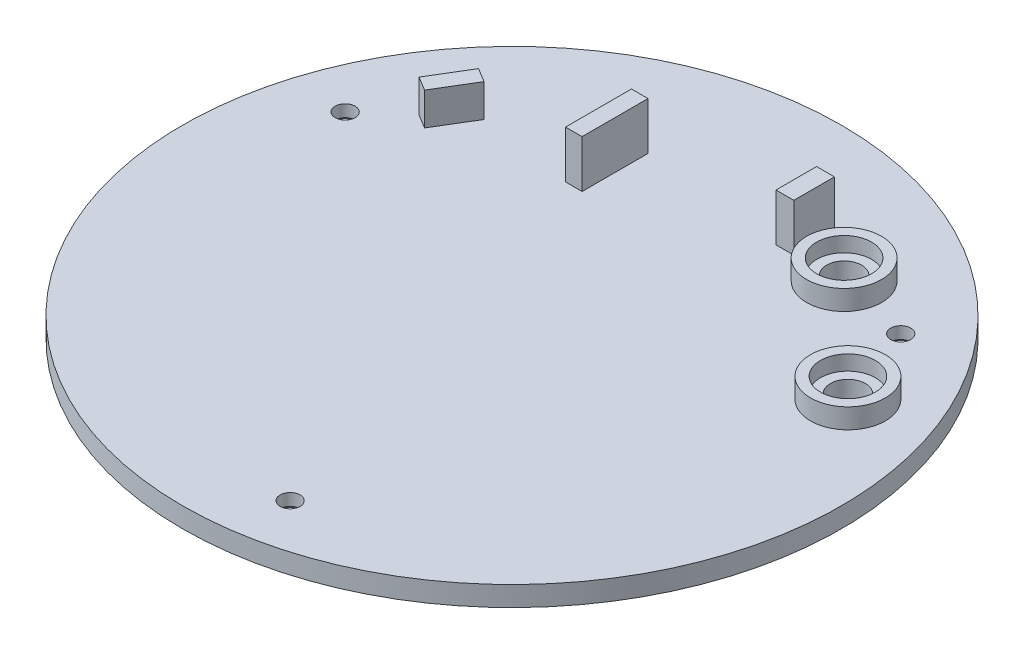
ISO-10303-21;
HEADER;
FILE_DESCRIPTION(('STEP AP214'),'2;1');
FILE_NAME('part.step','',(''),(''),'','','');
FILE_SCHEMA(('AUTOMOTIVE_DESIGN { 1 0 10303 214 1 1 1 1 }'));
ENDSEC;
DATA;
#1=APPLICATION_CONTEXT('core data for automotive mechanical design processes');
#2=APPLICATION_PROTOCOL_DEFINITION('international standard','automotive_design',2000,#1);
#3=PRODUCT_CONTEXT('',#1,'mechanical');
#4=PRODUCT('Part','Part','',(#3));
#5=PRODUCT_RELATED_PRODUCT_CATEGORY('part','',(#4));
#6=PRODUCT_DEFINITION_FORMATION('','',#4);
#7=PRODUCT_DEFINITION_CONTEXT('part definition',#1,'design');
#8=PRODUCT_DEFINITION('design','',#6,#7);
#9=PRODUCT_DEFINITION_SHAPE('','',#8);
#10=(LENGTH_UNIT() NAMED_UNIT(*) SI_UNIT(.MILLI.,.METRE.));
#11=(NAMED_UNIT(*) PLANE_ANGLE_UNIT() SI_UNIT($,.RADIAN.));
#12=(NAMED_UNIT(*) SI_UNIT($,.STERADIAN.) SOLID_ANGLE_UNIT());
#13=UNCERTAINTY_MEASURE_WITH_UNIT(LENGTH_MEASURE(1.E-05),#10,'distance_accuracy_value','');
#14=(GEOMETRIC_REPRESENTATION_CONTEXT(3) GLOBAL_UNCERTAINTY_ASSIGNED_CONTEXT((#13)) GLOBAL_UNIT_ASSIGNED_CONTEXT((#10,
#11,#12)) REPRESENTATION_CONTEXT('',''));
#15=CARTESIAN_POINT('',(0.,0.,0.));
#16=DIRECTION('',(0.,0.,1.));
#17=DIRECTION('',(1.,0.,0.));
#18=AXIS2_PLACEMENT_3D('',#15,#16,#17);
#19=CARTESIAN_POINT('',(21.052790792877,-12.25,-17.8713903028272));
#20=DIRECTION('',(0.,-1.,0.));
#21=DIRECTION('',(0.,0.,-1.));
#22=AXIS2_PLACEMENT_3D('',#19,#20,#21);
#23=CYLINDRICAL_SURFACE('',#22,1.);
#24=CARTESIAN_POINT('',(21.052790792877,-12.25,-17.8713903028272));
#25=DIRECTION('',(0.,-1.,0.));
#26=DIRECTION('',(0.,0.,-1.));
#27=AXIS2_PLACEMENT_3D('',#24,#25,#26);
#28=CIRCLE('',#27,1.);
#29=CARTESIAN_POINT('',(21.052790792877,-12.25,-18.8713903028272));
#30=VERTEX_POINT('',#29);
#31=EDGE_CURVE('E468',#30,#30,#28,.T.);
#32=ORIENTED_EDGE('',*,*,#31,.F.);
#33=EDGE_LOOP('',(#32));
#34=FACE_BOUND('',#33,.T.);
#35=CARTESIAN_POINT('',(21.052790792877,-13.45,-17.8713903028272));
#36=DIRECTION('',(0.,-1.,0.));
#37=DIRECTION('',(1.,0.,0.));
#38=AXIS2_PLACEMENT_3D('',#35,#36,#37);
#39=CIRCLE('',#38,1.);
#40=CARTESIAN_POINT('',(22.052790792877,-13.45,-17.8713903028272));
#41=VERTEX_POINT('',#40);
#42=EDGE_CURVE('E487',#41,#41,#39,.T.);
#43=ORIENTED_EDGE('',*,*,#42,.T.);
#44=EDGE_LOOP('',(#43));
#45=FACE_BOUND('',#44,.T.);
#46=ADVANCED_FACE('F75',(#34,#45),#23,.F.);
#47=CARTESIAN_POINT('',(4.95068260675662,-12.25,27.1679467986042));
#48=DIRECTION('',(0.,-1.,0.));
#49=DIRECTION('',(0.,0.,-1.));
#50=AXIS2_PLACEMENT_3D('',#47,#48,#49);
#51=CYLINDRICAL_SURFACE('',#50,1.);
#52=CARTESIAN_POINT('',(4.95068260675662,-12.25,27.1679467986042));
#53=DIRECTION('',(0.,-1.,0.));
#54=DIRECTION('',(0.,0.,-1.));
#55=AXIS2_PLACEMENT_3D('',#52,#53,#54);
#56=CIRCLE('',#55,1.);
#57=CARTESIAN_POINT('',(4.95068260675662,-12.25,26.1679467986042));
#58=VERTEX_POINT('',#57);
#59=EDGE_CURVE('E472',#58,#58,#56,.T.);
#60=ORIENTED_EDGE('',*,*,#59,.F.);
#61=EDGE_LOOP('',(#60));
#62=FACE_BOUND('',#61,.T.);
#63=CARTESIAN_POINT('',(4.95068260675662,-13.45,27.1679467986042));
#64=DIRECTION('',(0.,-1.,0.));
#65=DIRECTION('',(1.,0.,0.));
#66=AXIS2_PLACEMENT_3D('',#63,#64,#65);
#67=CIRCLE('',#66,1.);
#68=CARTESIAN_POINT('',(5.95068260675662,-13.45,27.1679467986042));
#69=VERTEX_POINT('',#68);
#70=EDGE_CURVE('E489',#69,#69,#67,.T.);
#71=ORIENTED_EDGE('',*,*,#70,.T.);
#72=EDGE_LOOP('',(#71));
#73=FACE_BOUND('',#72,.T.);
#74=ADVANCED_FACE('F307',(#62,#73),#51,.F.);
#75=CARTESIAN_POINT('',(-26.0034733996337,-12.25,-9.29655649577725));
#76=DIRECTION('',(0.,-1.,0.));
#77=DIRECTION('',(0.,0.,-1.));
#78=AXIS2_PLACEMENT_3D('',#75,#76,#77);
#79=CYLINDRICAL_SURFACE('',#78,1.);
#80=CARTESIAN_POINT('',(-26.0034733996337,-12.25,-9.29655649577725));
#81=DIRECTION('',(0.,-1.,0.));
#82=DIRECTION('',(0.,0.,-1.));
#83=AXIS2_PLACEMENT_3D('',#80,#81,#82);
#84=CIRCLE('',#83,1.);
#85=CARTESIAN_POINT('',(-26.0034733996337,-12.25,-10.2965564957772));
#86=VERTEX_POINT('',#85);
#87=EDGE_CURVE('E469',#86,#86,#84,.T.);
#88=ORIENTED_EDGE('',*,*,#87,.F.);
#89=EDGE_LOOP('',(#88));
#90=FACE_BOUND('',#89,.T.);
#91=CARTESIAN_POINT('',(-26.0034733996338,-13.45,-9.29655649577689));
#92=DIRECTION('',(0.,-1.,0.));
#93=DIRECTION('',(1.,0.,0.));
#94=AXIS2_PLACEMENT_3D('',#91,#92,#93);
#95=CIRCLE('',#94,1.00000000000001);
#96=CARTESIAN_POINT('',(-25.0034733996338,-13.45,-9.29655649577689));
#97=VERTEX_POINT('',#96);
#98=EDGE_CURVE('E480',#97,#97,#95,.T.);
#99=ORIENTED_EDGE('',*,*,#98,.T.);
#100=EDGE_LOOP('',(#99));
#101=FACE_BOUND('',#100,.T.);
#102=ADVANCED_FACE('F314',(#90,#101),#79,.F.);
#103=CARTESIAN_POINT('',(24.0914108515431,-10.25,-9.54622091284926));
#104=DIRECTION('',(0.,-1.,0.));
#105=DIRECTION('',(0.,0.,-1.));
#106=AXIS2_PLACEMENT_3D('',#103,#104,#105);
#107=CYLINDRICAL_SURFACE('',#106,1.75);
#108=CARTESIAN_POINT('',(24.0914108515431,-14.25,-9.54622091284926));
#109=DIRECTION('',(0.,-1.,0.));
#110=DIRECTION('',(0.,0.,-1.));
#111=AXIS2_PLACEMENT_3D('',#108,#109,#110);
#112=CIRCLE('',#111,1.75);
#113=CARTESIAN_POINT('',(24.0914108515431,-14.25,-11.2962209128493));
#114=VERTEX_POINT('',#113);
#115=EDGE_CURVE('E422',#114,#114,#112,.T.);
#116=ORIENTED_EDGE('',*,*,#115,.T.);
#117=EDGE_LOOP('',(#116));
#118=FACE_BOUND('',#117,.T.);
#119=CARTESIAN_POINT('',(24.0914108515431,-11.75,-9.54622091284926));
#120=DIRECTION('',(0.,1.,0.));
#121=DIRECTION('',(0.,0.,1.));
#122=AXIS2_PLACEMENT_3D('',#119,#120,#121);
#123=CIRCLE('',#122,1.75);
#124=CARTESIAN_POINT('',(24.0914108515431,-11.75,-7.79622091284926));
#125=VERTEX_POINT('',#124);
#126=EDGE_CURVE('E463',#125,#125,#123,.T.);
#127=ORIENTED_EDGE('',*,*,#126,.T.);
#128=EDGE_LOOP('',(#127));
#129=FACE_BOUND('',#128,.T.);
#130=ADVANCED_FACE('F344',(#118,#129),#107,.F.);
#131=CARTESIAN_POINT('',(13.6355146671841,-10.25,-19.6205793603908));
#132=DIRECTION('',(0.,-1.,0.));
#133=DIRECTION('',(0.,0.,-1.));
#134=AXIS2_PLACEMENT_3D('',#131,#132,#133);
#135=CYLINDRICAL_SURFACE('',#134,1.75);
#136=CARTESIAN_POINT('',(13.6355146671841,-14.25,-19.6205793603908));
#137=DIRECTION('',(0.,-1.,0.));
#138=DIRECTION('',(0.,0.,-1.));
#139=AXIS2_PLACEMENT_3D('',#136,#137,#138);
#140=CIRCLE('',#139,1.75);
#141=CARTESIAN_POINT('',(13.6355146671841,-14.25,-21.3705793603908));
#142=VERTEX_POINT('',#141);
#143=EDGE_CURVE('E428',#142,#142,#140,.T.);
#144=ORIENTED_EDGE('',*,*,#143,.T.);
#145=EDGE_LOOP('',(#144));
#146=FACE_BOUND('',#145,.T.);
#147=CARTESIAN_POINT('',(13.6355146671841,-11.75,-19.6205793603908));
#148=DIRECTION('',(0.,1.,0.));
#149=DIRECTION('',(0.,0.,1.));
#150=AXIS2_PLACEMENT_3D('',#147,#148,#149);
#151=CIRCLE('',#150,1.75);
#152=CARTESIAN_POINT('',(13.6355146671841,-11.75,-17.8705793603908));
#153=VERTEX_POINT('',#152);
#154=EDGE_CURVE('E458',#153,#153,#151,.T.);
#155=ORIENTED_EDGE('',*,*,#154,.T.);
#156=EDGE_LOOP('',(#155));
#157=FACE_BOUND('',#156,.T.);
#158=ADVANCED_FACE('F278',(#146,#157),#135,.F.);
#159=CARTESIAN_POINT('',(0.,-12.25,0.));
#160=DIRECTION('',(0.,-1.,0.));
#161=DIRECTION('',(0.,0.,-1.));
#162=AXIS2_PLACEMENT_3D('',#159,#160,#161);
#163=PLANE('',#162);
#164=ORIENTED_EDGE('',*,*,#87,.T.);
#165=EDGE_LOOP('',(#164));
#166=FACE_BOUND('',#165,.T.);
#167=ORIENTED_EDGE('',*,*,#59,.T.);
#168=EDGE_LOOP('',(#167));
#169=FACE_BOUND('',#168,.T.);
#170=ORIENTED_EDGE('',*,*,#31,.T.);
#171=EDGE_LOOP('',(#170));
#172=FACE_BOUND('',#171,.T.);
#173=CARTESIAN_POINT('',(13.6355146671841,-12.25,-19.6205793603908));
#174=DIRECTION('',(0.,-1.,0.));
#175=DIRECTION('',(0.,0.,-1.));
#176=AXIS2_PLACEMENT_3D('',#173,#174,#175);
#177=CIRCLE('',#176,3.75);
#178=CARTESIAN_POINT('',(13.6355146671841,-12.25,-23.3705793603908));
#179=VERTEX_POINT('',#178);
#180=EDGE_CURVE('E12',#179,#179,#177,.F.);
#181=ORIENTED_EDGE('',*,*,#180,.F.);
#182=EDGE_LOOP('',(#181));
#183=FACE_BOUND('',#182,.T.);
#184=CARTESIAN_POINT('',(24.0914108515431,-12.25,-9.54622091284926));
#185=DIRECTION('',(0.,-1.,0.));
#186=DIRECTION('',(0.,0.,-1.));
#187=AXIS2_PLACEMENT_3D('',#184,#185,#186);
#188=CIRCLE('',#187,3.75);
#189=CARTESIAN_POINT('',(24.0914108515431,-12.25,-13.2962209128493));
#190=VERTEX_POINT('',#189);
#191=EDGE_CURVE('E83',#190,#190,#188,.F.);
#192=ORIENTED_EDGE('',*,*,#191,.F.);
#193=EDGE_LOOP('',(#192));
#194=FACE_BOUND('',#193,.T.);
#195=DIRECTION('',(-1.,0.,0.));
#196=VECTOR('',#195,1.);
#197=CARTESIAN_POINT('',(8.88267400832492,-12.25,-23.403156600962));
#198=LINE('',#197,#196);
#199=CARTESIAN_POINT('',(8.88267400832492,-12.25,-23.403156600962));
#200=VERTEX_POINT('',#199);
#201=CARTESIAN_POINT('',(7.09558008984392,-12.25,-23.403156600962));
#202=VERTEX_POINT('',#201);
#203=EDGE_CURVE('E203',#200,#202,#198,.T.);
#204=ORIENTED_EDGE('',*,*,#203,.F.);
#205=DIRECTION('',(0.,0.,-1.));
#206=VECTOR('',#205,1.);
#207=CARTESIAN_POINT('',(8.88267400832492,-12.25,-23.403156600962));
#208=LINE('',#207,#206);
#209=CARTESIAN_POINT('',(8.88267400832492,-12.25,-19.339156600962));
#210=VERTEX_POINT('',#209);
#211=EDGE_CURVE('E215',#210,#200,#208,.T.);
#212=ORIENTED_EDGE('',*,*,#211,.F.);
#213=DIRECTION('',(1.,0.,0.));
#214=VECTOR('',#213,1.);
#215=CARTESIAN_POINT('',(8.88267400832492,-12.25,-19.339156600962));
#216=LINE('',#215,#214);
#217=CARTESIAN_POINT('',(7.09558008984392,-12.25,-19.339156600962));
#218=VERTEX_POINT('',#217);
#219=EDGE_CURVE('E213',#218,#210,#216,.T.);
#220=ORIENTED_EDGE('',*,*,#219,.F.);
#221=DIRECTION('',(0.,0.,1.));
#222=VECTOR('',#221,1.);
#223=CARTESIAN_POINT('',(7.09558008984392,-12.25,-23.403156600962));
#224=LINE('',#223,#222);
#225=EDGE_CURVE('E210',#202,#218,#224,.T.);
#226=ORIENTED_EDGE('',*,*,#225,.F.);
#227=EDGE_LOOP('',(#204,#212,#220,#226));
#228=FACE_BOUND('',#227,.T.);
#229=CARTESIAN_POINT('',(0.,-12.25,0.));
#230=DIRECTION('',(0.,-1.,0.));
#231=DIRECTION('',(0.,0.,-1.));
#232=AXIS2_PLACEMENT_3D('',#229,#230,#231);
#233=CIRCLE('',#232,33.);
#234=CARTESIAN_POINT('',(0.,-12.25,-33.));
#235=VERTEX_POINT('',#234);
#236=EDGE_CURVE('E205',#235,#235,#233,.T.);
#237=ORIENTED_EDGE('',*,*,#236,.F.);
#238=EDGE_LOOP('',(#237));
#239=FACE_BOUND('',#238,.T.);
#240=DIRECTION('',(1.,0.,0.));
#241=VECTOR('',#240,1.);
#242=CARTESIAN_POINT('',(-8.89732599167508,-12.25,-14.259156600962));
#243=LINE('',#242,#241);
#244=CARTESIAN_POINT('',(-8.89732599167508,-12.25,-14.259156600962));
#245=VERTEX_POINT('',#244);
#246=CARTESIAN_POINT('',(-7.24129071075527,-12.25,-14.259156600962));
#247=VERTEX_POINT('',#246);
#248=EDGE_CURVE('E206',#245,#247,#243,.T.);
#249=ORIENTED_EDGE('',*,*,#248,.F.);
#250=DIRECTION('',(0.,0.,1.));
#251=VECTOR('',#250,1.);
#252=CARTESIAN_POINT('',(-8.89732599167508,-12.25,-14.259156600962));
#253=LINE('',#252,#251);
#254=CARTESIAN_POINT('',(-8.89732599167508,-12.25,-20.863156600962));
#255=VERTEX_POINT('',#254);
#256=EDGE_CURVE('E250',#255,#245,#253,.T.);
#257=ORIENTED_EDGE('',*,*,#256,.F.);
#258=DIRECTION('',(-1.,0.,0.));
#259=VECTOR('',#258,1.);
#260=CARTESIAN_POINT('',(-8.89732599167508,-12.25,-20.863156600962));
#261=LINE('',#260,#259);
#262=CARTESIAN_POINT('',(-7.24129071075527,-12.25,-20.863156600962));
#263=VERTEX_POINT('',#262);
#264=EDGE_CURVE('E249',#263,#255,#261,.T.);
#265=ORIENTED_EDGE('',*,*,#264,.F.);
#266=DIRECTION('',(0.,0.,-1.));
#267=VECTOR('',#266,1.);
#268=CARTESIAN_POINT('',(-7.24129071075527,-12.25,-14.259156600962));
#269=LINE('',#268,#267);
#270=EDGE_CURVE('E254',#247,#263,#269,.T.);
#271=ORIENTED_EDGE('',*,*,#270,.F.);
#272=EDGE_LOOP('',(#249,#257,#265,#271));
#273=FACE_BOUND('',#272,.T.);
#274=DIRECTION('',(0.855858760805712,0.,0.517209610846619));
#275=VECTOR('',#274,1.);
#276=CARTESIAN_POINT('',(-22.0469894878762,-12.25,-12.733470206983));
#277=LINE('',#276,#275);
#278=CARTESIAN_POINT('',(-22.0469894878762,-12.25,-12.733470206983));
#279=VERTEX_POINT('',#278);
#280=CARTESIAN_POINT('',(-20.6377240159575,-12.25,-11.8818277635213));
#281=VERTEX_POINT('',#280);
#282=EDGE_CURVE('E158',#279,#281,#277,.T.);
#283=ORIENTED_EDGE('',*,*,#282,.F.);
#284=DIRECTION('',(-0.517209610846618,0.,0.855858760805713));
#285=VECTOR('',#284,1.);
#286=CARTESIAN_POINT('',(-22.0469894878762,-12.25,-12.733470206983));
#287=LINE('',#286,#285);
#288=CARTESIAN_POINT('',(-19.8006122147574,-12.25,-16.4506897422628));
#289=VERTEX_POINT('',#288);
#290=EDGE_CURVE('E161',#289,#279,#287,.T.);
#291=ORIENTED_EDGE('',*,*,#290,.F.);
#292=DIRECTION('',(-0.855858760805712,0.,-0.517209610846619));
#293=VECTOR('',#292,1.);
#294=CARTESIAN_POINT('',(-19.8006122147574,-12.25,-16.4506897422628));
#295=LINE('',#294,#293);
#296=CARTESIAN_POINT('',(-18.3913467428388,-12.25,-15.5990472988012));
#297=VERTEX_POINT('',#296);
#298=EDGE_CURVE('E95',#297,#289,#295,.T.);
#299=ORIENTED_EDGE('',*,*,#298,.F.);
#300=DIRECTION('',(0.517209610846618,0.,-0.855858760805713));
#301=VECTOR('',#300,1.);
#302=CARTESIAN_POINT('',(-20.6377240159575,-12.25,-11.8818277635213));
#303=LINE('',#302,#301);
#304=EDGE_CURVE('E87',#281,#297,#303,.T.);
#305=ORIENTED_EDGE('',*,*,#304,.F.);
#306=EDGE_LOOP('',(#283,#291,#299,#305));
#307=FACE_BOUND('',#306,.T.);
#308=ADVANCED_FACE('F163',(#166,#169,#172,#183,#194,#228,#239,#273,#307),#163,.F.);
#309=CARTESIAN_POINT('',(0.,-14.25,0.));
#310=DIRECTION('',(0.,1.,0.));
#311=DIRECTION('',(0.,0.,1.));
#312=AXIS2_PLACEMENT_3D('',#309,#310,#311);
#313=CYLINDRICAL_SURFACE('',#312,33.);
#314=CARTESIAN_POINT('',(0.,-14.25,0.));
#315=DIRECTION('',(0.,-1.,0.));
#316=DIRECTION('',(0.,0.,-1.));
#317=AXIS2_PLACEMENT_3D('',#314,#315,#316);
#318=CIRCLE('',#317,33.);
#319=CARTESIAN_POINT('',(0.,-14.25,-33.));
#320=VERTEX_POINT('',#319);
#321=EDGE_CURVE('E261',#320,#320,#318,.T.);
#322=ORIENTED_EDGE('',*,*,#321,.F.);
#323=EDGE_LOOP('',(#322));
#324=FACE_BOUND('',#323,.T.);
#325=ORIENTED_EDGE('',*,*,#236,.T.);
#326=EDGE_LOOP('',(#325));
#327=FACE_BOUND('',#326,.T.);
#328=ADVANCED_FACE('F72',(#324,#327),#313,.T.);
#329=CARTESIAN_POINT('',(0.,-14.25,0.));
#330=DIRECTION('',(0.,-1.,0.));
#331=DIRECTION('',(0.,0.,-1.));
#332=AXIS2_PLACEMENT_3D('',#329,#330,#331);
#333=PLANE('',#332);
#334=CARTESIAN_POINT('',(4.95068260675662,-14.25,27.1679467986042));
#335=DIRECTION('',(0.,-1.,0.));
#336=DIRECTION('',(0.,0.,-1.));
#337=AXIS2_PLACEMENT_3D('',#334,#335,#336);
#338=CIRCLE('',#337,2.);
#339=CARTESIAN_POINT('',(4.95068260675662,-14.25,25.1679467986042));
#340=VERTEX_POINT('',#339);
#341=EDGE_CURVE('E406',#340,#340,#338,.T.);
#342=ORIENTED_EDGE('',*,*,#341,.F.);
#343=EDGE_LOOP('',(#342));
#344=FACE_BOUND('',#343,.T.);
#345=CARTESIAN_POINT('',(21.052790792877,-14.25,-17.8713903028272));
#346=DIRECTION('',(0.,-1.,0.));
#347=DIRECTION('',(0.,0.,-1.));
#348=AXIS2_PLACEMENT_3D('',#345,#346,#347);
#349=CIRCLE('',#348,2.);
#350=CARTESIAN_POINT('',(21.052790792877,-14.25,-19.8713903028272));
#351=VERTEX_POINT('',#350);
#352=EDGE_CURVE('E415',#351,#351,#349,.T.);
#353=ORIENTED_EDGE('',*,*,#352,.F.);
#354=EDGE_LOOP('',(#353));
#355=FACE_BOUND('',#354,.T.);
#356=CARTESIAN_POINT('',(-26.0034733996338,-14.25,-9.29655649577689));
#357=DIRECTION('',(0.,-1.,0.));
#358=DIRECTION('',(0.,0.,-1.));
#359=AXIS2_PLACEMENT_3D('',#356,#357,#358);
#360=CIRCLE('',#359,2.00000000000001);
#361=CARTESIAN_POINT('',(-26.0034733996338,-14.25,-11.2965564957769));
#362=VERTEX_POINT('',#361);
#363=EDGE_CURVE('E420',#362,#362,#360,.T.);
#364=ORIENTED_EDGE('',*,*,#363,.F.);
#365=EDGE_LOOP('',(#364));
#366=FACE_BOUND('',#365,.T.);
#367=ORIENTED_EDGE('',*,*,#115,.F.);
#368=EDGE_LOOP('',(#367));
#369=FACE_BOUND('',#368,.T.);
#370=ORIENTED_EDGE('',*,*,#143,.F.);
#371=EDGE_LOOP('',(#370));
#372=FACE_BOUND('',#371,.T.);
#373=ORIENTED_EDGE('',*,*,#321,.T.);
#374=EDGE_LOOP('',(#373));
#375=FACE_BOUND('',#374,.T.);
#376=ADVANCED_FACE('F399',(#344,#355,#366,#369,#372,#375),#333,.T.);
#377=CARTESIAN_POINT('',(-8.89732599167508,-0.681529624720492,-14.259156600962));
#378=DIRECTION('',(1.,0.,0.));
#379=DIRECTION('',(0.,0.,-1.));
#380=AXIS2_PLACEMENT_3D('',#377,#378,#379);
#381=PLANE('',#380);
#382=DIRECTION('',(0.,-1.,0.));
#383=VECTOR('',#382,1.);
#384=CARTESIAN_POINT('',(-8.89732599167508,-0.681529624720492,-14.259156600962));
#385=LINE('',#384,#383);
#386=CARTESIAN_POINT('',(-8.89732599167508,-7.49000000004321,-14.259156600962));
#387=VERTEX_POINT('',#386);
#388=EDGE_CURVE('E242',#387,#245,#385,.T.);
#389=ORIENTED_EDGE('',*,*,#388,.F.);
#390=DIRECTION('',(0.,0.,-1.));
#391=VECTOR('',#390,1.);
#392=CARTESIAN_POINT('',(-8.89732599167508,-7.49000000004321,-14.2591566009614));
#393=LINE('',#392,#391);
#394=CARTESIAN_POINT('',(-8.89732599167508,-7.49000000004351,-20.863156600962));
#395=VERTEX_POINT('',#394);
#396=EDGE_CURVE('E233',#387,#395,#393,.T.);
#397=ORIENTED_EDGE('',*,*,#396,.T.);
#398=DIRECTION('',(0.,-1.,0.));
#399=VECTOR('',#398,1.);
#400=CARTESIAN_POINT('',(-8.89732599167508,-0.681529624720492,-20.863156600962));
#401=LINE('',#400,#399);
#402=EDGE_CURVE('E241',#395,#255,#401,.T.);
#403=ORIENTED_EDGE('',*,*,#402,.T.);
#404=ORIENTED_EDGE('',*,*,#256,.T.);
#405=EDGE_LOOP('',(#389,#397,#403,#404));
#406=FACE_BOUND('',#405,.T.);
#407=ADVANCED_FACE('F289',(#406),#381,.F.);
#408=CARTESIAN_POINT('',(-8.89732599167508,-0.681529624720492,-20.863156600962));
#409=DIRECTION('',(0.,0.,1.));
#410=DIRECTION('',(1.,0.,0.));
#411=AXIS2_PLACEMENT_3D('',#408,#409,#410);
#412=PLANE('',#411);
#413=ORIENTED_EDGE('',*,*,#402,.F.);
#414=DIRECTION('',(1.,0.,0.));
#415=VECTOR('',#414,1.);
#416=CARTESIAN_POINT('',(-8.89732599167508,-7.49000000004382,-20.863156600962));
#417=LINE('',#416,#415);
#418=CARTESIAN_POINT('',(-7.24129071075527,-7.49000000004382,-20.863156600962));
#419=VERTEX_POINT('',#418);
#420=EDGE_CURVE('E232',#395,#419,#417,.T.);
#421=ORIENTED_EDGE('',*,*,#420,.T.);
#422=DIRECTION('',(0.,-1.,0.));
#423=VECTOR('',#422,1.);
#424=CARTESIAN_POINT('',(-7.24129071075527,-0.681529624720492,-20.863156600962));
#425=LINE('',#424,#423);
#426=EDGE_CURVE('E238',#419,#263,#425,.T.);
#427=ORIENTED_EDGE('',*,*,#426,.T.);
#428=ORIENTED_EDGE('',*,*,#264,.T.);
#429=EDGE_LOOP('',(#413,#421,#427,#428));
#430=FACE_BOUND('',#429,.T.);
#431=ADVANCED_FACE('F288',(#430),#412,.F.);
#432=CARTESIAN_POINT('',(-7.24129071075527,-0.681529624720492,-14.259156600962));
#433=DIRECTION('',(-1.,0.,0.));
#434=DIRECTION('',(0.,0.,1.));
#435=AXIS2_PLACEMENT_3D('',#432,#433,#434);
#436=PLANE('',#435);
#437=ORIENTED_EDGE('',*,*,#426,.F.);
#438=DIRECTION('',(0.,0.,1.));
#439=VECTOR('',#438,1.);
#440=CARTESIAN_POINT('',(-7.24129071075527,-7.49000000004321,-14.2591566009614));
#441=LINE('',#440,#439);
#442=CARTESIAN_POINT('',(-7.24129071075527,-7.49000000004321,-14.259156600962));
#443=VERTEX_POINT('',#442);
#444=EDGE_CURVE('E256',#419,#443,#441,.T.);
#445=ORIENTED_EDGE('',*,*,#444,.T.);
#446=DIRECTION('',(0.,-1.,0.));
#447=VECTOR('',#446,1.);
#448=CARTESIAN_POINT('',(-7.24129071075527,-0.681529624720492,-14.259156600962));
#449=LINE('',#448,#447);
#450=EDGE_CURVE('E234',#443,#247,#449,.T.);
#451=ORIENTED_EDGE('',*,*,#450,.T.);
#452=ORIENTED_EDGE('',*,*,#270,.T.);
#453=EDGE_LOOP('',(#437,#445,#451,#452));
#454=FACE_BOUND('',#453,.T.);
#455=ADVANCED_FACE('F292',(#454),#436,.F.);
#456=CARTESIAN_POINT('',(-8.89732599167508,-0.681529624720492,-14.259156600962));
#457=DIRECTION('',(0.,0.,-1.));
#458=DIRECTION('',(-1.,0.,0.));
#459=AXIS2_PLACEMENT_3D('',#456,#457,#458);
#460=PLANE('',#459);
#461=ORIENTED_EDGE('',*,*,#450,.F.);
#462=DIRECTION('',(-1.,0.,0.));
#463=VECTOR('',#462,1.);
#464=CARTESIAN_POINT('',(-8.89732599167508,-7.49000000004321,-14.259156600962));
#465=LINE('',#464,#463);
#466=EDGE_CURVE('E194',#443,#387,#465,.T.);
#467=ORIENTED_EDGE('',*,*,#466,.T.);
#468=ORIENTED_EDGE('',*,*,#388,.T.);
#469=ORIENTED_EDGE('',*,*,#248,.T.);
#470=EDGE_LOOP('',(#461,#467,#468,#469));
#471=FACE_BOUND('',#470,.T.);
#472=ADVANCED_FACE('F285',(#471),#460,.F.);
#473=CARTESIAN_POINT('',(-0.00732599167508133,-7.49000000004375,-20.1646566009619));
#474=DIRECTION('',(0.,-1.,0.));
#475=DIRECTION('',(0.,0.,-1.));
#476=AXIS2_PLACEMENT_3D('',#473,#474,#475);
#477=PLANE('',#476);
#478=ORIENTED_EDGE('',*,*,#444,.F.);
#479=ORIENTED_EDGE('',*,*,#420,.F.);
#480=ORIENTED_EDGE('',*,*,#396,.F.);
#481=ORIENTED_EDGE('',*,*,#466,.F.);
#482=EDGE_LOOP('',(#478,#479,#480,#481));
#483=FACE_BOUND('',#482,.T.);
#484=ADVANCED_FACE('F295',(#483),#477,.F.);
#485=CARTESIAN_POINT('',(8.88267400832492,-0.681529624720492,-23.403156600962));
#486=DIRECTION('',(-1.,0.,0.));
#487=DIRECTION('',(0.,0.,1.));
#488=AXIS2_PLACEMENT_3D('',#485,#486,#487);
#489=PLANE('',#488);
#490=DIRECTION('',(0.,-1.,0.));
#491=VECTOR('',#490,1.);
#492=CARTESIAN_POINT('',(8.88267400832492,-0.681529624720492,-23.403156600962));
#493=LINE('',#492,#491);
#494=CARTESIAN_POINT('',(8.88267400832492,-7.49000000004404,-23.403156600962));
#495=VERTEX_POINT('',#494);
#496=EDGE_CURVE('E219',#495,#200,#493,.T.);
#497=ORIENTED_EDGE('',*,*,#496,.F.);
#498=DIRECTION('',(0.,0.,1.));
#499=VECTOR('',#498,1.);
#500=CARTESIAN_POINT('',(8.88267400832492,-7.49000000004404,-23.4031566009614));
#501=LINE('',#500,#499);
#502=CARTESIAN_POINT('',(8.88267400832492,-7.49000000004386,-19.339156600962));
#503=VERTEX_POINT('',#502);
#504=EDGE_CURVE('E199',#495,#503,#501,.T.);
#505=ORIENTED_EDGE('',*,*,#504,.T.);
#506=DIRECTION('',(0.,-1.,0.));
#507=VECTOR('',#506,1.);
#508=CARTESIAN_POINT('',(8.88267400832492,-0.681529624720492,-19.339156600962));
#509=LINE('',#508,#507);
#510=EDGE_CURVE('E216',#503,#210,#509,.T.);
#511=ORIENTED_EDGE('',*,*,#510,.T.);
#512=ORIENTED_EDGE('',*,*,#211,.T.);
#513=EDGE_LOOP('',(#497,#505,#511,#512));
#514=FACE_BOUND('',#513,.T.);
#515=ADVANCED_FACE('F298',(#514),#489,.F.);
#516=CARTESIAN_POINT('',(8.88267400832492,-0.681529624720492,-19.339156600962));
#517=DIRECTION('',(0.,0.,-1.));
#518=DIRECTION('',(-1.,0.,0.));
#519=AXIS2_PLACEMENT_3D('',#516,#517,#518);
#520=PLANE('',#519);
#521=ORIENTED_EDGE('',*,*,#510,.F.);
#522=DIRECTION('',(-1.,0.,0.));
#523=VECTOR('',#522,1.);
#524=CARTESIAN_POINT('',(8.88267400832492,-7.49000000004367,-19.339156600962));
#525=LINE('',#524,#523);
#526=CARTESIAN_POINT('',(7.09558008984392,-7.49000000004367,-19.339156600962));
#527=VERTEX_POINT('',#526);
#528=EDGE_CURVE('E192',#503,#527,#525,.T.);
#529=ORIENTED_EDGE('',*,*,#528,.T.);
#530=DIRECTION('',(0.,-1.,0.));
#531=VECTOR('',#530,1.);
#532=CARTESIAN_POINT('',(7.09558008984392,-0.681529624720492,-19.339156600962));
#533=LINE('',#532,#531);
#534=EDGE_CURVE('E225',#527,#218,#533,.T.);
#535=ORIENTED_EDGE('',*,*,#534,.T.);
#536=ORIENTED_EDGE('',*,*,#219,.T.);
#537=EDGE_LOOP('',(#521,#529,#535,#536));
#538=FACE_BOUND('',#537,.T.);
#539=ADVANCED_FACE('F305',(#538),#520,.F.);
#540=CARTESIAN_POINT('',(7.09558008984392,-0.681529624720492,-23.403156600962));
#541=DIRECTION('',(1.,0.,0.));
#542=DIRECTION('',(0.,0.,-1.));
#543=AXIS2_PLACEMENT_3D('',#540,#541,#542);
#544=PLANE('',#543);
#545=ORIENTED_EDGE('',*,*,#534,.F.);
#546=DIRECTION('',(0.,0.,-1.));
#547=VECTOR('',#546,1.);
#548=CARTESIAN_POINT('',(7.09558008984392,-7.49000000004404,-23.4031566009614));
#549=LINE('',#548,#547);
#550=CARTESIAN_POINT('',(7.09558008984392,-7.49000000004404,-23.403156600962));
#551=VERTEX_POINT('',#550);
#552=EDGE_CURVE('E198',#527,#551,#549,.T.);
#553=ORIENTED_EDGE('',*,*,#552,.T.);
#554=DIRECTION('',(0.,-1.,0.));
#555=VECTOR('',#554,1.);
#556=CARTESIAN_POINT('',(7.09558008984392,-0.681529624720492,-23.403156600962));
#557=LINE('',#556,#555);
#558=EDGE_CURVE('E228',#551,#202,#557,.T.);
#559=ORIENTED_EDGE('',*,*,#558,.T.);
#560=ORIENTED_EDGE('',*,*,#225,.T.);
#561=EDGE_LOOP('',(#545,#553,#559,#560));
#562=FACE_BOUND('',#561,.T.);
#563=ADVANCED_FACE('F381',(#562),#544,.F.);
#564=CARTESIAN_POINT('',(8.88267400832492,-0.681529624720492,-23.403156600962));
#565=DIRECTION('',(0.,0.,1.));
#566=DIRECTION('',(1.,0.,0.));
#567=AXIS2_PLACEMENT_3D('',#564,#565,#566);
#568=PLANE('',#567);
#569=ORIENTED_EDGE('',*,*,#558,.F.);
#570=DIRECTION('',(1.,0.,0.));
#571=VECTOR('',#570,1.);
#572=CARTESIAN_POINT('',(8.88267400832492,-7.49000000004404,-23.403156600962));
#573=LINE('',#572,#571);
#574=EDGE_CURVE('E196',#551,#495,#573,.T.);
#575=ORIENTED_EDGE('',*,*,#574,.T.);
#576=ORIENTED_EDGE('',*,*,#496,.T.);
#577=ORIENTED_EDGE('',*,*,#203,.T.);
#578=EDGE_LOOP('',(#569,#575,#576,#577));
#579=FACE_BOUND('',#578,.T.);
#580=ADVANCED_FACE('F378',(#579),#568,.F.);
#581=CARTESIAN_POINT('',(-0.00732599167508133,-7.49000000004375,-20.1646566009619));
#582=DIRECTION('',(0.,-1.,0.));
#583=DIRECTION('',(0.,0.,-1.));
#584=AXIS2_PLACEMENT_3D('',#581,#582,#583);
#585=PLANE('',#584);
#586=ORIENTED_EDGE('',*,*,#552,.F.);
#587=ORIENTED_EDGE('',*,*,#528,.F.);
#588=ORIENTED_EDGE('',*,*,#504,.F.);
#589=ORIENTED_EDGE('',*,*,#574,.F.);
#590=EDGE_LOOP('',(#586,#587,#588,#589));
#591=FACE_BOUND('',#590,.T.);
#592=ADVANCED_FACE('F380',(#591),#585,.F.);
#593=CARTESIAN_POINT('',(-22.0469894878762,-3.11552345234927,-12.733470206983));
#594=DIRECTION('',(0.517209610846619,0.,-0.855858760805712));
#595=DIRECTION('',(-0.855858760805712,0.,-0.517209610846619));
#596=AXIS2_PLACEMENT_3D('',#593,#594,#595);
#597=PLANE('',#596);
#598=DIRECTION('',(0.855858760805712,0.,0.517209610846619));
#599=VECTOR('',#598,1.);
#600=CARTESIAN_POINT('',(-22.0469894878762,-8.96686720059496,-12.733470206983));
#601=LINE('',#600,#599);
#602=CARTESIAN_POINT('',(-22.0469894878762,-8.96686720059496,-12.733470206983));
#603=VERTEX_POINT('',#602);
#604=CARTESIAN_POINT('',(-20.6377240159575,-8.96686720059496,-11.8818277635213));
#605=VERTEX_POINT('',#604);
#606=EDGE_CURVE('E173',#603,#605,#601,.T.);
#607=ORIENTED_EDGE('',*,*,#606,.F.);
#608=DIRECTION('',(0.,-1.,0.));
#609=VECTOR('',#608,1.);
#610=CARTESIAN_POINT('',(-22.0469894878762,-3.11552345234927,-12.733470206983));
#611=LINE('',#610,#609);
#612=EDGE_CURVE('E171',#603,#279,#611,.T.);
#613=ORIENTED_EDGE('',*,*,#612,.T.);
#614=ORIENTED_EDGE('',*,*,#282,.T.);
#615=DIRECTION('',(0.,-1.,0.));
#616=VECTOR('',#615,1.);
#617=CARTESIAN_POINT('',(-20.6377240159575,-3.11552345234927,-11.8818277635213));
#618=LINE('',#617,#616);
#619=EDGE_CURVE('E190',#605,#281,#618,.T.);
#620=ORIENTED_EDGE('',*,*,#619,.F.);
#621=EDGE_LOOP('',(#607,#613,#614,#620));
#622=FACE_BOUND('',#621,.T.);
#623=ADVANCED_FACE('F175',(#622),#597,.F.);
#624=CARTESIAN_POINT('',(-20.6377240159575,-3.11552345234927,-11.8818277635213));
#625=DIRECTION('',(-0.855858760805712,0.,-0.517209610846618));
#626=DIRECTION('',(-0.517209610846618,0.,0.855858760805713));
#627=AXIS2_PLACEMENT_3D('',#624,#625,#626);
#628=PLANE('',#627);
#629=DIRECTION('',(0.517209610846618,0.,-0.855858760805713));
#630=VECTOR('',#629,1.);
#631=CARTESIAN_POINT('',(-20.6377240159575,-8.96686720059496,-11.8818277635213));
#632=LINE('',#631,#630);
#633=CARTESIAN_POINT('',(-18.3913467428388,-8.96686720059496,-15.5990472988012));
#634=VERTEX_POINT('',#633);
#635=EDGE_CURVE('E442',#605,#634,#632,.T.);
#636=ORIENTED_EDGE('',*,*,#635,.F.);
#637=ORIENTED_EDGE('',*,*,#619,.T.);
#638=ORIENTED_EDGE('',*,*,#304,.T.);
#639=DIRECTION('',(0.,-1.,0.));
#640=VECTOR('',#639,1.);
#641=CARTESIAN_POINT('',(-18.3913467428388,-3.11552345234927,-15.5990472988012));
#642=LINE('',#641,#640);
#643=EDGE_CURVE('E184',#634,#297,#642,.T.);
#644=ORIENTED_EDGE('',*,*,#643,.F.);
#645=EDGE_LOOP('',(#636,#637,#638,#644));
#646=FACE_BOUND('',#645,.T.);
#647=ADVANCED_FACE('F369',(#646),#628,.F.);
#648=CARTESIAN_POINT('',(-19.8006122147574,-3.11552345234927,-16.4506897422628));
#649=DIRECTION('',(-0.517209610846619,0.,0.855858760805712));
#650=DIRECTION('',(0.855858760805712,0.,0.517209610846619));
#651=AXIS2_PLACEMENT_3D('',#648,#649,#650);
#652=PLANE('',#651);
#653=DIRECTION('',(-0.855858760805712,0.,-0.517209610846619));
#654=VECTOR('',#653,1.);
#655=CARTESIAN_POINT('',(-19.8006122147574,-8.96686720059496,-16.4506897422628));
#656=LINE('',#655,#654);
#657=CARTESIAN_POINT('',(-19.8006122147574,-8.96686720059496,-16.4506897422628));
#658=VERTEX_POINT('',#657);
#659=EDGE_CURVE('E186',#634,#658,#656,.T.);
#660=ORIENTED_EDGE('',*,*,#659,.F.);
#661=ORIENTED_EDGE('',*,*,#643,.T.);
#662=ORIENTED_EDGE('',*,*,#298,.T.);
#663=DIRECTION('',(0.,-1.,0.));
#664=VECTOR('',#663,1.);
#665=CARTESIAN_POINT('',(-19.8006122147574,-3.11552345234927,-16.4506897422628));
#666=LINE('',#665,#664);
#667=EDGE_CURVE('E176',#658,#289,#666,.T.);
#668=ORIENTED_EDGE('',*,*,#667,.F.);
#669=EDGE_LOOP('',(#660,#661,#662,#668));
#670=FACE_BOUND('',#669,.T.);
#671=ADVANCED_FACE('F370',(#670),#652,.F.);
#672=CARTESIAN_POINT('',(-22.0469894878762,-3.11552345234927,-12.733470206983));
#673=DIRECTION('',(0.855858760805712,0.,0.517209610846618));
#674=DIRECTION('',(0.517209610846618,0.,-0.855858760805713));
#675=AXIS2_PLACEMENT_3D('',#672,#673,#674);
#676=PLANE('',#675);
#677=DIRECTION('',(-0.517209610846618,0.,0.855858760805713));
#678=VECTOR('',#677,1.);
#679=CARTESIAN_POINT('',(-22.0469894878762,-8.96686720059496,-12.733470206983));
#680=LINE('',#679,#678);
#681=EDGE_CURVE('E188',#658,#603,#680,.T.);
#682=ORIENTED_EDGE('',*,*,#681,.F.);
#683=ORIENTED_EDGE('',*,*,#667,.T.);
#684=ORIENTED_EDGE('',*,*,#290,.T.);
#685=ORIENTED_EDGE('',*,*,#612,.F.);
#686=EDGE_LOOP('',(#682,#683,#684,#685));
#687=FACE_BOUND('',#686,.T.);
#688=ADVANCED_FACE('F178',(#687),#676,.F.);
#689=CARTESIAN_POINT('',(-24.5554213383465,-8.96686720059496,-12.6647294845464));
#690=DIRECTION('',(0.,1.,0.));
#691=DIRECTION('',(-0.601815023152039,0.,0.7986355100473));
#692=AXIS2_PLACEMENT_3D('',#689,#690,#691);
#693=PLANE('',#692);
#694=ORIENTED_EDGE('',*,*,#606,.T.);
#695=ORIENTED_EDGE('',*,*,#635,.T.);
#696=ORIENTED_EDGE('',*,*,#659,.T.);
#697=ORIENTED_EDGE('',*,*,#681,.T.);
#698=EDGE_LOOP('',(#694,#695,#696,#697));
#699=FACE_BOUND('',#698,.T.);
#700=ADVANCED_FACE('F357',(#699),#693,.T.);
#701=CARTESIAN_POINT('',(24.0914108515431,-10.25,-9.54622091284926));
#702=DIRECTION('',(0.,1.,0.));
#703=DIRECTION('',(0.,0.,1.));
#704=AXIS2_PLACEMENT_3D('',#701,#702,#703);
#705=PLANE('',#704);
#706=CARTESIAN_POINT('',(24.0914108515431,-10.25,-9.54622091284926));
#707=DIRECTION('',(0.,1.,0.));
#708=DIRECTION('',(1.,0.,0.));
#709=AXIS2_PLACEMENT_3D('',#706,#707,#708);
#710=CIRCLE('',#709,2.75);
#711=CARTESIAN_POINT('',(26.8414108515431,-10.25,-9.54622091284926));
#712=VERTEX_POINT('',#711);
#713=EDGE_CURVE('E464',#712,#712,#710,.T.);
#714=ORIENTED_EDGE('',*,*,#713,.F.);
#715=EDGE_LOOP('',(#714));
#716=FACE_BOUND('',#715,.T.);
#717=CARTESIAN_POINT('',(24.0914108515431,-10.25,-9.54622091284926));
#718=DIRECTION('',(0.,1.,0.));
#719=DIRECTION('',(0.,0.,1.));
#720=AXIS2_PLACEMENT_3D('',#717,#718,#719);
#721=CIRCLE('',#720,3.75);
#722=CARTESIAN_POINT('',(24.0914108515431,-10.25,-5.79622091284926));
#723=VERTEX_POINT('',#722);
#724=EDGE_CURVE('E431',#723,#723,#721,.T.);
#725=ORIENTED_EDGE('',*,*,#724,.T.);
#726=EDGE_LOOP('',(#725));
#727=FACE_BOUND('',#726,.T.);
#728=ADVANCED_FACE('F355',(#716,#727),#705,.T.);
#729=CARTESIAN_POINT('',(24.0914108515431,-10.25,-9.54622091284926));
#730=DIRECTION('',(0.,-1.,0.));
#731=DIRECTION('',(0.,0.,-1.));
#732=AXIS2_PLACEMENT_3D('',#729,#730,#731);
#733=CYLINDRICAL_SURFACE('',#732,3.75);
#734=ORIENTED_EDGE('',*,*,#724,.F.);
#735=EDGE_LOOP('',(#734));
#736=FACE_BOUND('',#735,.T.);
#737=ORIENTED_EDGE('',*,*,#191,.T.);
#738=EDGE_LOOP('',(#737));
#739=FACE_BOUND('',#738,.T.);
#740=ADVANCED_FACE('F275',(#736,#739),#733,.T.);
#741=CARTESIAN_POINT('',(13.6355146671841,-10.25,-19.6205793603908));
#742=DIRECTION('',(0.,1.,0.));
#743=DIRECTION('',(0.,0.,1.));
#744=AXIS2_PLACEMENT_3D('',#741,#742,#743);
#745=PLANE('',#744);
#746=CARTESIAN_POINT('',(13.6355146671841,-10.25,-19.6205793603908));
#747=DIRECTION('',(0.,1.,0.));
#748=DIRECTION('',(1.,0.,0.));
#749=AXIS2_PLACEMENT_3D('',#746,#747,#748);
#750=CIRCLE('',#749,2.75);
#751=CARTESIAN_POINT('',(16.3855146671841,-10.25,-19.6205793603908));
#752=VERTEX_POINT('',#751);
#753=EDGE_CURVE('E432',#752,#752,#750,.T.);
#754=ORIENTED_EDGE('',*,*,#753,.F.);
#755=EDGE_LOOP('',(#754));
#756=FACE_BOUND('',#755,.T.);
#757=CARTESIAN_POINT('',(13.6355146671841,-10.25,-19.6205793603908));
#758=DIRECTION('',(0.,1.,0.));
#759=DIRECTION('',(0.,0.,1.));
#760=AXIS2_PLACEMENT_3D('',#757,#758,#759);
#761=CIRCLE('',#760,3.75);
#762=CARTESIAN_POINT('',(13.6355146671841,-10.25,-15.8705793603908));
#763=VERTEX_POINT('',#762);
#764=EDGE_CURVE('E170',#763,#763,#761,.T.);
#765=ORIENTED_EDGE('',*,*,#764,.T.);
#766=EDGE_LOOP('',(#765));
#767=FACE_BOUND('',#766,.T.);
#768=ADVANCED_FACE('F345',(#756,#767),#745,.T.);
#769=CARTESIAN_POINT('',(13.6355146671841,-10.25,-19.6205793603908));
#770=DIRECTION('',(0.,-1.,0.));
#771=DIRECTION('',(0.,0.,-1.));
#772=AXIS2_PLACEMENT_3D('',#769,#770,#771);
#773=CYLINDRICAL_SURFACE('',#772,3.75);
#774=ORIENTED_EDGE('',*,*,#764,.F.);
#775=EDGE_LOOP('',(#774));
#776=FACE_BOUND('',#775,.T.);
#777=ORIENTED_EDGE('',*,*,#180,.T.);
#778=EDGE_LOOP('',(#777));
#779=FACE_BOUND('',#778,.T.);
#780=ADVANCED_FACE('F336',(#776,#779),#773,.T.);
#781=CARTESIAN_POINT('',(13.6355146671841,-11.75,-19.6205793603908));
#782=DIRECTION('',(0.,1.,0.));
#783=DIRECTION('',(0.,0.,1.));
#784=AXIS2_PLACEMENT_3D('',#781,#782,#783);
#785=CYLINDRICAL_SURFACE('',#784,2.75);
#786=CARTESIAN_POINT('',(13.6355146671841,-11.75,-19.6205793603908));
#787=DIRECTION('',(0.,1.,0.));
#788=DIRECTION('',(1.,0.,0.));
#789=AXIS2_PLACEMENT_3D('',#786,#787,#788);
#790=CIRCLE('',#789,2.75);
#791=CARTESIAN_POINT('',(16.3855146671841,-11.75,-19.6205793603908));
#792=VERTEX_POINT('',#791);
#793=EDGE_CURVE('E429',#792,#792,#790,.T.);
#794=ORIENTED_EDGE('',*,*,#793,.F.);
#795=EDGE_LOOP('',(#794));
#796=FACE_BOUND('',#795,.T.);
#797=ORIENTED_EDGE('',*,*,#753,.T.);
#798=EDGE_LOOP('',(#797));
#799=FACE_BOUND('',#798,.T.);
#800=ADVANCED_FACE('F333',(#796,#799),#785,.F.);
#801=CARTESIAN_POINT('',(13.6355146671841,-11.75,-19.6205793603908));
#802=DIRECTION('',(0.,1.,0.));
#803=DIRECTION('',(0.,0.,1.));
#804=AXIS2_PLACEMENT_3D('',#801,#802,#803);
#805=PLANE('',#804);
#806=ORIENTED_EDGE('',*,*,#154,.F.);
#807=EDGE_LOOP('',(#806));
#808=FACE_BOUND('',#807,.T.);
#809=ORIENTED_EDGE('',*,*,#793,.T.);
#810=EDGE_LOOP('',(#809));
#811=FACE_BOUND('',#810,.T.);
#812=ADVANCED_FACE('F326',(#808,#811),#805,.T.);
#813=CARTESIAN_POINT('',(24.0914108515431,-11.75,-9.54622091284926));
#814=DIRECTION('',(0.,1.,0.));
#815=DIRECTION('',(0.,0.,1.));
#816=AXIS2_PLACEMENT_3D('',#813,#814,#815);
#817=CYLINDRICAL_SURFACE('',#816,2.75);
#818=CARTESIAN_POINT('',(24.0914108515431,-11.75,-9.54622091284926));
#819=DIRECTION('',(0.,1.,0.));
#820=DIRECTION('',(1.,0.,0.));
#821=AXIS2_PLACEMENT_3D('',#818,#819,#820);
#822=CIRCLE('',#821,2.75);
#823=CARTESIAN_POINT('',(26.8414108515431,-11.75,-9.54622091284926));
#824=VERTEX_POINT('',#823);
#825=EDGE_CURVE('E456',#824,#824,#822,.T.);
#826=ORIENTED_EDGE('',*,*,#825,.F.);
#827=EDGE_LOOP('',(#826));
#828=FACE_BOUND('',#827,.T.);
#829=ORIENTED_EDGE('',*,*,#713,.T.);
#830=EDGE_LOOP('',(#829));
#831=FACE_BOUND('',#830,.T.);
#832=ADVANCED_FACE('F328',(#828,#831),#817,.F.);
#833=CARTESIAN_POINT('',(24.0914108515431,-11.75,-9.54622091284926));
#834=DIRECTION('',(0.,1.,0.));
#835=DIRECTION('',(0.,0.,1.));
#836=AXIS2_PLACEMENT_3D('',#833,#834,#835);
#837=PLANE('',#836);
#838=ORIENTED_EDGE('',*,*,#126,.F.);
#839=EDGE_LOOP('',(#838));
#840=FACE_BOUND('',#839,.T.);
#841=ORIENTED_EDGE('',*,*,#825,.T.);
#842=EDGE_LOOP('',(#841));
#843=FACE_BOUND('',#842,.T.);
#844=ADVANCED_FACE('F324',(#840,#843),#837,.T.);
#845=CARTESIAN_POINT('',(-26.0034733996338,-13.45,-9.29655649577689));
#846=DIRECTION('',(0.,-1.,0.));
#847=DIRECTION('',(0.,0.,-1.));
#848=AXIS2_PLACEMENT_3D('',#845,#846,#847);
#849=CYLINDRICAL_SURFACE('',#848,2.00000000000001);
#850=CARTESIAN_POINT('',(-26.0034733996338,-13.45,-9.29655649577689));
#851=DIRECTION('',(0.,-1.,0.));
#852=DIRECTION('',(0.,0.,-1.));
#853=AXIS2_PLACEMENT_3D('',#850,#851,#852);
#854=CIRCLE('',#853,2.00000000000001);
#855=CARTESIAN_POINT('',(-26.0034733996338,-13.45,-11.2965564957769));
#856=VERTEX_POINT('',#855);
#857=EDGE_CURVE('E485',#856,#856,#854,.T.);
#858=ORIENTED_EDGE('',*,*,#857,.F.);
#859=EDGE_LOOP('',(#858));
#860=FACE_BOUND('',#859,.T.);
#861=ORIENTED_EDGE('',*,*,#363,.T.);
#862=EDGE_LOOP('',(#861));
#863=FACE_BOUND('',#862,.T.);
#864=ADVANCED_FACE('F321',(#860,#863),#849,.F.);
#865=CARTESIAN_POINT('',(-26.0034733996338,-13.45,-9.29655649577689));
#866=DIRECTION('',(0.,-1.,0.));
#867=DIRECTION('',(0.,0.,-1.));
#868=AXIS2_PLACEMENT_3D('',#865,#866,#867);
#869=PLANE('',#868);
#870=ORIENTED_EDGE('',*,*,#98,.F.);
#871=EDGE_LOOP('',(#870));
#872=FACE_BOUND('',#871,.T.);
#873=ORIENTED_EDGE('',*,*,#857,.T.);
#874=EDGE_LOOP('',(#873));
#875=FACE_BOUND('',#874,.T.);
#876=ADVANCED_FACE('F512',(#872,#875),#869,.T.);
#877=CARTESIAN_POINT('',(4.95068260675662,-13.45,27.1679467986042));
#878=DIRECTION('',(0.,-1.,0.));
#879=DIRECTION('',(0.,0.,-1.));
#880=AXIS2_PLACEMENT_3D('',#877,#878,#879);
#881=CYLINDRICAL_SURFACE('',#880,2.);
#882=CARTESIAN_POINT('',(4.95068260675662,-13.45,27.1679467986042));
#883=DIRECTION('',(0.,-1.,0.));
#884=DIRECTION('',(0.,0.,-1.));
#885=AXIS2_PLACEMENT_3D('',#882,#883,#884);
#886=CIRCLE('',#885,2.);
#887=CARTESIAN_POINT('',(4.95068260675662,-13.45,25.1679467986042));
#888=VERTEX_POINT('',#887);
#889=EDGE_CURVE('E475',#888,#888,#886,.T.);
#890=ORIENTED_EDGE('',*,*,#889,.F.);
#891=EDGE_LOOP('',(#890));
#892=FACE_BOUND('',#891,.T.);
#893=ORIENTED_EDGE('',*,*,#341,.T.);
#894=EDGE_LOOP('',(#893));
#895=FACE_BOUND('',#894,.T.);
#896=ADVANCED_FACE('F504',(#892,#895),#881,.F.);
#897=CARTESIAN_POINT('',(4.95068260675662,-13.45,27.1679467986042));
#898=DIRECTION('',(0.,-1.,0.));
#899=DIRECTION('',(0.,0.,-1.));
#900=AXIS2_PLACEMENT_3D('',#897,#898,#899);
#901=PLANE('',#900);
#902=ORIENTED_EDGE('',*,*,#70,.F.);
#903=EDGE_LOOP('',(#902));
#904=FACE_BOUND('',#903,.T.);
#905=ORIENTED_EDGE('',*,*,#889,.T.);
#906=EDGE_LOOP('',(#905));
#907=FACE_BOUND('',#906,.T.);
#908=ADVANCED_FACE('F501',(#904,#907),#901,.T.);
#909=CARTESIAN_POINT('',(21.052790792877,-13.45,-17.8713903028272));
#910=DIRECTION('',(0.,-1.,0.));
#911=DIRECTION('',(0.,0.,-1.));
#912=AXIS2_PLACEMENT_3D('',#909,#910,#911);
#913=CYLINDRICAL_SURFACE('',#912,2.);
#914=CARTESIAN_POINT('',(21.052790792877,-13.45,-17.8713903028272));
#915=DIRECTION('',(0.,-1.,0.));
#916=DIRECTION('',(0.,0.,-1.));
#917=AXIS2_PLACEMENT_3D('',#914,#915,#916);
#918=CIRCLE('',#917,2.);
#919=CARTESIAN_POINT('',(21.052790792877,-13.45,-19.8713903028272));
#920=VERTEX_POINT('',#919);
#921=EDGE_CURVE('E481',#920,#920,#918,.T.);
#922=ORIENTED_EDGE('',*,*,#921,.F.);
#923=EDGE_LOOP('',(#922));
#924=FACE_BOUND('',#923,.T.);
#925=ORIENTED_EDGE('',*,*,#352,.T.);
#926=EDGE_LOOP('',(#925));
#927=FACE_BOUND('',#926,.T.);
#928=ADVANCED_FACE('F502',(#924,#927),#913,.F.);
#929=CARTESIAN_POINT('',(21.052790792877,-13.45,-17.8713903028272));
#930=DIRECTION('',(0.,-1.,0.));
#931=DIRECTION('',(0.,0.,-1.));
#932=AXIS2_PLACEMENT_3D('',#929,#930,#931);
#933=PLANE('',#932);
#934=ORIENTED_EDGE('',*,*,#42,.F.);
#935=EDGE_LOOP('',(#934));
#936=FACE_BOUND('',#935,.T.);
#937=ORIENTED_EDGE('',*,*,#921,.T.);
#938=EDGE_LOOP('',(#937));
#939=FACE_BOUND('',#938,.T.);
#940=ADVANCED_FACE('F523',(#936,#939),#933,.T.);
#941=CLOSED_SHELL('',(#46,#74,#102,#130,#158,#308,#328,#376,#407,#431,#455,#472,#484,#515,#539,
#563,#580,#592,#623,#647,#671,#688,#700,#728,#740,#768,#780,#800,#812,#832,#844,#864,#876,#896,
#908,#928,#940));
#942=MANIFOLD_SOLID_BREP('B2',#941);
#943=ADVANCED_BREP_SHAPE_REPRESENTATION('',(#18,#942),#14);
#944=SHAPE_DEFINITION_REPRESENTATION(#9,#943);
ENDSEC;
END-ISO-10303-21;
